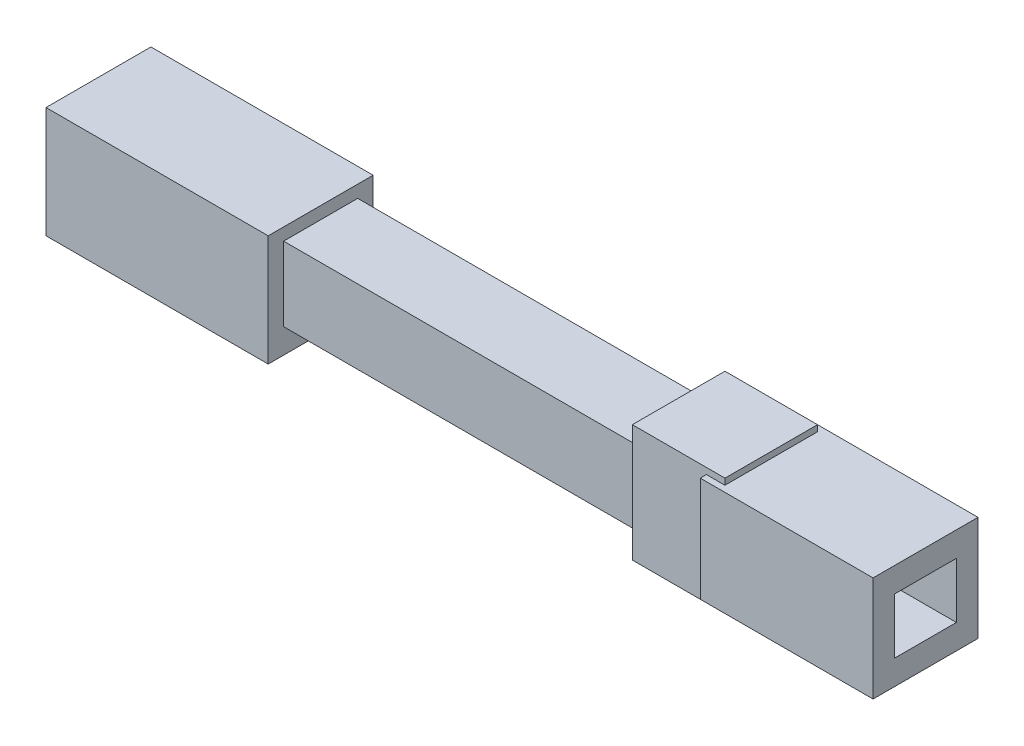
ISO-10303-21;
HEADER;
FILE_DESCRIPTION(('STEP AP214'),'2;1');
FILE_NAME('part.step','',(''),(''),'','','');
FILE_SCHEMA(('AUTOMOTIVE_DESIGN { 1 0 10303 214 1 1 1 1 }'));
ENDSEC;
DATA;
#1=APPLICATION_CONTEXT('core data for automotive mechanical design processes');
#2=APPLICATION_PROTOCOL_DEFINITION('international standard','automotive_design',2000,#1);
#3=PRODUCT_CONTEXT('',#1,'mechanical');
#4=PRODUCT('Part','Part','',(#3));
#5=PRODUCT_RELATED_PRODUCT_CATEGORY('part','',(#4));
#6=PRODUCT_DEFINITION_FORMATION('','',#4);
#7=PRODUCT_DEFINITION_CONTEXT('part definition',#1,'design');
#8=PRODUCT_DEFINITION('design','',#6,#7);
#9=PRODUCT_DEFINITION_SHAPE('','',#8);
#10=(LENGTH_UNIT() NAMED_UNIT(*) SI_UNIT(.MILLI.,.METRE.));
#11=(NAMED_UNIT(*) PLANE_ANGLE_UNIT() SI_UNIT($,.RADIAN.));
#12=(NAMED_UNIT(*) SI_UNIT($,.STERADIAN.) SOLID_ANGLE_UNIT());
#13=UNCERTAINTY_MEASURE_WITH_UNIT(LENGTH_MEASURE(1.E-05),#10,'distance_accuracy_value','');
#14=(GEOMETRIC_REPRESENTATION_CONTEXT(3) GLOBAL_UNCERTAINTY_ASSIGNED_CONTEXT((#13)) GLOBAL_UNIT_ASSIGNED_CONTEXT((#10,
#11,#12)) REPRESENTATION_CONTEXT('',''));
#15=CARTESIAN_POINT('',(0.,0.,0.));
#16=DIRECTION('',(0.,0.,1.));
#17=DIRECTION('',(1.,0.,0.));
#18=AXIS2_PLACEMENT_3D('',#15,#16,#17);
#19=CARTESIAN_POINT('',(198.,184.,15.));
#20=DIRECTION('',(-1.,0.,0.));
#21=DIRECTION('',(0.,0.,1.));
#22=AXIS2_PLACEMENT_3D('',#19,#20,#21);
#23=PLANE('',#22);
#24=DIRECTION('',(0.,0.,-1.));
#25=VECTOR('',#24,1.);
#26=CARTESIAN_POINT('',(198.,186.,15.));
#27=LINE('',#26,#25);
#28=CARTESIAN_POINT('',(198.,186.,15.));
#29=VERTEX_POINT('',#28);
#30=CARTESIAN_POINT('',(198.,186.,-15.));
#31=VERTEX_POINT('',#30);
#32=EDGE_CURVE('E297',#29,#31,#27,.T.);
#33=ORIENTED_EDGE('',*,*,#32,.F.);
#34=DIRECTION('',(0.,1.,0.));
#35=VECTOR('',#34,1.);
#36=CARTESIAN_POINT('',(198.,184.,15.));
#37=LINE('',#36,#35);
#38=CARTESIAN_POINT('',(198.,184.,15.));
#39=VERTEX_POINT('',#38);
#40=EDGE_CURVE('E317',#39,#29,#37,.T.);
#41=ORIENTED_EDGE('',*,*,#40,.F.);
#42=DIRECTION('',(0.,0.,-1.));
#43=VECTOR('',#42,1.);
#44=CARTESIAN_POINT('',(198.,184.,15.));
#45=LINE('',#44,#43);
#46=CARTESIAN_POINT('',(198.,184.,-15.));
#47=VERTEX_POINT('',#46);
#48=EDGE_CURVE('E350',#39,#47,#45,.T.);
#49=ORIENTED_EDGE('',*,*,#48,.T.);
#50=DIRECTION('',(0.,1.,0.));
#51=VECTOR('',#50,1.);
#52=CARTESIAN_POINT('',(198.,184.,-15.));
#53=LINE('',#52,#51);
#54=EDGE_CURVE('E331',#47,#31,#53,.T.);
#55=ORIENTED_EDGE('',*,*,#54,.T.);
#56=EDGE_LOOP('',(#33,#41,#49,#55));
#57=FACE_BOUND('',#56,.T.);
#58=ADVANCED_FACE('F44',(#57),#23,.F.);
#59=DIRECTION('',(0.,0.,1.));
#60=VECTOR('',#59,1.);
#61=CARTESIAN_POINT('',(198.,220.,15.));
#62=LINE('',#61,#60);
#63=CARTESIAN_POINT('',(198.,220.,-15.));
#64=VERTEX_POINT('',#63);
#65=CARTESIAN_POINT('',(198.,220.,15.));
#66=VERTEX_POINT('',#65);
#67=EDGE_CURVE('E294',#64,#66,#62,.T.);
#68=ORIENTED_EDGE('',*,*,#67,.F.);
#69=CARTESIAN_POINT('',(198.,222.,-15.));
#70=VERTEX_POINT('',#69);
#71=EDGE_CURVE('E334',#64,#70,#53,.T.);
#72=ORIENTED_EDGE('',*,*,#71,.T.);
#73=DIRECTION('',(0.,0.,-1.));
#74=VECTOR('',#73,1.);
#75=CARTESIAN_POINT('',(198.,222.,15.));
#76=LINE('',#75,#74);
#77=CARTESIAN_POINT('',(198.,222.,15.));
#78=VERTEX_POINT('',#77);
#79=EDGE_CURVE('E342',#78,#70,#76,.T.);
#80=ORIENTED_EDGE('',*,*,#79,.F.);
#81=EDGE_CURVE('E318',#66,#78,#37,.T.);
#82=ORIENTED_EDGE('',*,*,#81,.F.);
#83=EDGE_LOOP('',(#68,#72,#80,#82));
#84=FACE_BOUND('',#83,.T.);
#85=ADVANCED_FACE('F478',(#84),#23,.F.);
#86=CARTESIAN_POINT('',(0.,0.,15.));
#87=DIRECTION('',(0.,0.,-1.));
#88=DIRECTION('',(-1.,0.,0.));
#89=AXIS2_PLACEMENT_3D('',#86,#87,#88);
#90=PLANE('',#89);
#91=DIRECTION('',(1.,0.,0.));
#92=VECTOR('',#91,1.);
#93=CARTESIAN_POINT('',(0.,186.,15.));
#94=LINE('',#93,#92);
#95=CARTESIAN_POINT('',(192.,186.,15.));
#96=VERTEX_POINT('',#95);
#97=EDGE_CURVE('E302',#96,#29,#94,.T.);
#98=ORIENTED_EDGE('',*,*,#97,.F.);
#99=DIRECTION('',(0.,-1.,0.));
#100=VECTOR('',#99,1.);
#101=CARTESIAN_POINT('',(192.,0.,15.));
#102=LINE('',#101,#100);
#103=CARTESIAN_POINT('',(192.,220.,15.));
#104=VERTEX_POINT('',#103);
#105=EDGE_CURVE('E308',#104,#96,#102,.T.);
#106=ORIENTED_EDGE('',*,*,#105,.F.);
#107=DIRECTION('',(-1.,0.,0.));
#108=VECTOR('',#107,1.);
#109=CARTESIAN_POINT('',(0.,220.,15.));
#110=LINE('',#109,#108);
#111=EDGE_CURVE('E296',#66,#104,#110,.T.);
#112=ORIENTED_EDGE('',*,*,#111,.F.);
#113=ORIENTED_EDGE('',*,*,#81,.T.);
#114=DIRECTION('',(-1.,0.,0.));
#115=VECTOR('',#114,1.);
#116=CARTESIAN_POINT('',(168.,222.,15.));
#117=LINE('',#116,#115);
#118=CARTESIAN_POINT('',(168.,222.,15.));
#119=VERTEX_POINT('',#118);
#120=EDGE_CURVE('E323',#78,#119,#117,.T.);
#121=ORIENTED_EDGE('',*,*,#120,.T.);
#122=DIRECTION('',(0.,-1.,0.));
#123=VECTOR('',#122,1.);
#124=CARTESIAN_POINT('',(168.,184.,15.));
#125=LINE('',#124,#123);
#126=CARTESIAN_POINT('',(168.,184.,15.));
#127=VERTEX_POINT('',#126);
#128=EDGE_CURVE('E309',#119,#127,#125,.T.);
#129=ORIENTED_EDGE('',*,*,#128,.T.);
#130=DIRECTION('',(1.,0.,0.));
#131=VECTOR('',#130,1.);
#132=CARTESIAN_POINT('',(168.,184.,15.));
#133=LINE('',#132,#131);
#134=EDGE_CURVE('E314',#127,#39,#133,.T.);
#135=ORIENTED_EDGE('',*,*,#134,.T.);
#136=ORIENTED_EDGE('',*,*,#40,.T.);
#137=EDGE_LOOP('',(#98,#106,#112,#113,#121,#129,#135,#136));
#138=FACE_BOUND('',#137,.T.);
#139=ADVANCED_FACE('F483',(#138),#90,.F.);
#140=CARTESIAN_POINT('',(0.,0.,-15.));
#141=DIRECTION('',(0.,0.,-1.));
#142=DIRECTION('',(-1.,0.,0.));
#143=AXIS2_PLACEMENT_3D('',#140,#141,#142);
#144=PLANE('',#143);
#145=DIRECTION('',(0.,-1.,0.));
#146=VECTOR('',#145,1.);
#147=CARTESIAN_POINT('',(192.,0.,-15.));
#148=LINE('',#147,#146);
#149=CARTESIAN_POINT('',(192.,220.,-15.));
#150=VERTEX_POINT('',#149);
#151=CARTESIAN_POINT('',(192.,186.,-15.));
#152=VERTEX_POINT('',#151);
#153=EDGE_CURVE('E444',#150,#152,#148,.T.);
#154=ORIENTED_EDGE('',*,*,#153,.T.);
#155=DIRECTION('',(1.,0.,0.));
#156=VECTOR('',#155,1.);
#157=CARTESIAN_POINT('',(0.,186.,-15.));
#158=LINE('',#157,#156);
#159=EDGE_CURVE('E446',#152,#31,#158,.T.);
#160=ORIENTED_EDGE('',*,*,#159,.T.);
#161=ORIENTED_EDGE('',*,*,#54,.F.);
#162=DIRECTION('',(1.,0.,0.));
#163=VECTOR('',#162,1.);
#164=CARTESIAN_POINT('',(168.,184.,-15.));
#165=LINE('',#164,#163);
#166=CARTESIAN_POINT('',(168.,184.,-15.));
#167=VERTEX_POINT('',#166);
#168=EDGE_CURVE('E329',#167,#47,#165,.T.);
#169=ORIENTED_EDGE('',*,*,#168,.F.);
#170=DIRECTION('',(0.,-1.,0.));
#171=VECTOR('',#170,1.);
#172=CARTESIAN_POINT('',(168.,184.,-15.));
#173=LINE('',#172,#171);
#174=CARTESIAN_POINT('',(168.,222.,-15.));
#175=VERTEX_POINT('',#174);
#176=EDGE_CURVE('E310',#175,#167,#173,.T.);
#177=ORIENTED_EDGE('',*,*,#176,.F.);
#178=DIRECTION('',(-1.,0.,0.));
#179=VECTOR('',#178,1.);
#180=CARTESIAN_POINT('',(168.,222.,-15.));
#181=LINE('',#180,#179);
#182=EDGE_CURVE('E312',#70,#175,#181,.T.);
#183=ORIENTED_EDGE('',*,*,#182,.F.);
#184=ORIENTED_EDGE('',*,*,#71,.F.);
#185=DIRECTION('',(-1.,0.,0.));
#186=VECTOR('',#185,1.);
#187=CARTESIAN_POINT('',(0.,220.,-15.));
#188=LINE('',#187,#186);
#189=EDGE_CURVE('E438',#64,#150,#188,.T.);
#190=ORIENTED_EDGE('',*,*,#189,.T.);
#191=EDGE_LOOP('',(#154,#160,#161,#169,#177,#183,#184,#190));
#192=FACE_BOUND('',#191,.T.);
#193=ADVANCED_FACE('F513',(#192),#144,.T.);
#194=CARTESIAN_POINT('',(48.,190.,12.));
#195=DIRECTION('',(0.,1.,0.));
#196=DIRECTION('',(0.,0.,1.));
#197=AXIS2_PLACEMENT_3D('',#194,#195,#196);
#198=PLANE('',#197);
#199=DIRECTION('',(0.,0.,-1.));
#200=VECTOR('',#199,1.);
#201=CARTESIAN_POINT('',(168.,190.,12.));
#202=LINE('',#201,#200);
#203=CARTESIAN_POINT('',(168.,190.,12.));
#204=VERTEX_POINT('',#203);
#205=CARTESIAN_POINT('',(168.,190.,-12.));
#206=VERTEX_POINT('',#205);
#207=EDGE_CURVE('E357',#204,#206,#202,.T.);
#208=ORIENTED_EDGE('',*,*,#207,.F.);
#209=DIRECTION('',(1.,0.,0.));
#210=VECTOR('',#209,1.);
#211=CARTESIAN_POINT('',(48.,190.,12.));
#212=LINE('',#211,#210);
#213=CARTESIAN_POINT('',(52.,190.,12.));
#214=VERTEX_POINT('',#213);
#215=EDGE_CURVE('E364',#214,#204,#212,.T.);
#216=ORIENTED_EDGE('',*,*,#215,.F.);
#217=DIRECTION('',(0.,0.,-1.));
#218=VECTOR('',#217,1.);
#219=CARTESIAN_POINT('',(52.,190.,17.));
#220=LINE('',#219,#218);
#221=CARTESIAN_POINT('',(52.,190.,-12.));
#222=VERTEX_POINT('',#221);
#223=EDGE_CURVE('E428',#214,#222,#220,.T.);
#224=ORIENTED_EDGE('',*,*,#223,.T.);
#225=DIRECTION('',(1.,0.,0.));
#226=VECTOR('',#225,1.);
#227=CARTESIAN_POINT('',(48.,190.,-12.));
#228=LINE('',#227,#226);
#229=EDGE_CURVE('E365',#222,#206,#228,.T.);
#230=ORIENTED_EDGE('',*,*,#229,.T.);
#231=EDGE_LOOP('',(#208,#216,#224,#230));
#232=FACE_BOUND('',#231,.T.);
#233=ADVANCED_FACE('F512',(#232),#198,.F.);
#234=CARTESIAN_POINT('',(48.,214.,12.));
#235=DIRECTION('',(0.,-1.,0.));
#236=DIRECTION('',(0.,0.,-1.));
#237=AXIS2_PLACEMENT_3D('',#234,#235,#236);
#238=PLANE('',#237);
#239=DIRECTION('',(0.,0.,1.));
#240=VECTOR('',#239,1.);
#241=CARTESIAN_POINT('',(168.,214.,12.));
#242=LINE('',#241,#240);
#243=CARTESIAN_POINT('',(168.,214.,-12.));
#244=VERTEX_POINT('',#243);
#245=CARTESIAN_POINT('',(168.,214.,12.));
#246=VERTEX_POINT('',#245);
#247=EDGE_CURVE('E352',#244,#246,#242,.T.);
#248=ORIENTED_EDGE('',*,*,#247,.F.);
#249=DIRECTION('',(-1.,0.,0.));
#250=VECTOR('',#249,1.);
#251=CARTESIAN_POINT('',(48.,214.,-12.));
#252=LINE('',#251,#250);
#253=CARTESIAN_POINT('',(52.,214.,-12.));
#254=VERTEX_POINT('',#253);
#255=EDGE_CURVE('E367',#244,#254,#252,.T.);
#256=ORIENTED_EDGE('',*,*,#255,.T.);
#257=DIRECTION('',(0.,0.,1.));
#258=VECTOR('',#257,1.);
#259=CARTESIAN_POINT('',(52.,214.,17.));
#260=LINE('',#259,#258);
#261=CARTESIAN_POINT('',(52.,214.,12.));
#262=VERTEX_POINT('',#261);
#263=EDGE_CURVE('E424',#254,#262,#260,.T.);
#264=ORIENTED_EDGE('',*,*,#263,.T.);
#265=DIRECTION('',(-1.,0.,0.));
#266=VECTOR('',#265,1.);
#267=CARTESIAN_POINT('',(48.,214.,12.));
#268=LINE('',#267,#266);
#269=EDGE_CURVE('E369',#246,#262,#268,.T.);
#270=ORIENTED_EDGE('',*,*,#269,.F.);
#271=EDGE_LOOP('',(#248,#256,#264,#270));
#272=FACE_BOUND('',#271,.T.);
#273=ADVANCED_FACE('F505',(#272),#238,.F.);
#274=CARTESIAN_POINT('',(0.,0.,12.));
#275=DIRECTION('',(0.,0.,-1.));
#276=DIRECTION('',(-1.,0.,0.));
#277=AXIS2_PLACEMENT_3D('',#274,#275,#276);
#278=PLANE('',#277);
#279=DIRECTION('',(0.,-1.,0.));
#280=VECTOR('',#279,1.);
#281=CARTESIAN_POINT('',(168.,0.,12.));
#282=LINE('',#281,#280);
#283=EDGE_CURVE('E363',#246,#204,#282,.T.);
#284=ORIENTED_EDGE('',*,*,#283,.F.);
#285=ORIENTED_EDGE('',*,*,#269,.T.);
#286=DIRECTION('',(0.,-1.,0.));
#287=VECTOR('',#286,1.);
#288=CARTESIAN_POINT('',(52.,182.,12.));
#289=LINE('',#288,#287);
#290=EDGE_CURVE('E435',#262,#214,#289,.T.);
#291=ORIENTED_EDGE('',*,*,#290,.T.);
#292=ORIENTED_EDGE('',*,*,#215,.T.);
#293=EDGE_LOOP('',(#284,#285,#291,#292));
#294=FACE_BOUND('',#293,.T.);
#295=ADVANCED_FACE('F496',(#294),#278,.F.);
#296=CARTESIAN_POINT('',(0.,0.,-12.));
#297=DIRECTION('',(0.,0.,-1.));
#298=DIRECTION('',(-1.,0.,0.));
#299=AXIS2_PLACEMENT_3D('',#296,#297,#298);
#300=PLANE('',#299);
#301=CARTESIAN_POINT('',(110.,202.,-12.));
#302=DIRECTION('',(0.,0.,-1.));
#303=DIRECTION('',(-1.,0.,0.));
#304=AXIS2_PLACEMENT_3D('',#301,#302,#303);
#305=CIRCLE('',#304,7.49999999999999);
#306=CARTESIAN_POINT('',(102.5,202.,-12.));
#307=VERTEX_POINT('',#306);
#308=EDGE_CURVE('E47',#307,#307,#305,.T.);
#309=ORIENTED_EDGE('',*,*,#308,.F.);
#310=EDGE_LOOP('',(#309));
#311=FACE_BOUND('',#310,.T.);
#312=ORIENTED_EDGE('',*,*,#255,.F.);
#313=DIRECTION('',(0.,-1.,0.));
#314=VECTOR('',#313,1.);
#315=CARTESIAN_POINT('',(168.,0.,-12.));
#316=LINE('',#315,#314);
#317=EDGE_CURVE('E434',#244,#206,#316,.T.);
#318=ORIENTED_EDGE('',*,*,#317,.T.);
#319=ORIENTED_EDGE('',*,*,#229,.F.);
#320=DIRECTION('',(0.,-1.,0.));
#321=VECTOR('',#320,1.);
#322=CARTESIAN_POINT('',(52.,182.,-12.));
#323=LINE('',#322,#321);
#324=EDGE_CURVE('E419',#254,#222,#323,.T.);
#325=ORIENTED_EDGE('',*,*,#324,.F.);
#326=EDGE_LOOP('',(#312,#318,#319,#325));
#327=FACE_BOUND('',#326,.T.);
#328=ADVANCED_FACE('F501',(#311,#327),#300,.T.);
#329=CARTESIAN_POINT('',(52.,182.,17.));
#330=DIRECTION('',(-1.,0.,0.));
#331=DIRECTION('',(0.,0.,1.));
#332=AXIS2_PLACEMENT_3D('',#329,#330,#331);
#333=PLANE('',#332);
#334=DIRECTION('',(0.,1.,0.));
#335=VECTOR('',#334,1.);
#336=CARTESIAN_POINT('',(52.,182.,-17.));
#337=LINE('',#336,#335);
#338=CARTESIAN_POINT('',(52.,182.,-17.));
#339=VERTEX_POINT('',#338);
#340=CARTESIAN_POINT('',(52.,218.,-17.));
#341=VERTEX_POINT('',#340);
#342=EDGE_CURVE('E399',#339,#341,#337,.T.);
#343=ORIENTED_EDGE('',*,*,#342,.T.);
#344=DIRECTION('',(0.,0.,-1.));
#345=VECTOR('',#344,1.);
#346=CARTESIAN_POINT('',(52.,218.,17.));
#347=LINE('',#346,#345);
#348=CARTESIAN_POINT('',(52.,218.,17.));
#349=VERTEX_POINT('',#348);
#350=EDGE_CURVE('E410',#349,#341,#347,.T.);
#351=ORIENTED_EDGE('',*,*,#350,.F.);
#352=DIRECTION('',(0.,1.,0.));
#353=VECTOR('',#352,1.);
#354=CARTESIAN_POINT('',(52.,182.,17.));
#355=LINE('',#354,#353);
#356=CARTESIAN_POINT('',(52.,182.,17.));
#357=VERTEX_POINT('',#356);
#358=EDGE_CURVE('E390',#357,#349,#355,.T.);
#359=ORIENTED_EDGE('',*,*,#358,.F.);
#360=DIRECTION('',(0.,0.,-1.));
#361=VECTOR('',#360,1.);
#362=CARTESIAN_POINT('',(52.,182.,17.));
#363=LINE('',#362,#361);
#364=EDGE_CURVE('E415',#357,#339,#363,.T.);
#365=ORIENTED_EDGE('',*,*,#364,.T.);
#366=EDGE_LOOP('',(#343,#351,#359,#365));
#367=FACE_BOUND('',#366,.T.);
#368=ORIENTED_EDGE('',*,*,#290,.F.);
#369=ORIENTED_EDGE('',*,*,#263,.F.);
#370=ORIENTED_EDGE('',*,*,#324,.T.);
#371=ORIENTED_EDGE('',*,*,#223,.F.);
#372=EDGE_LOOP('',(#368,#369,#370,#371));
#373=FACE_BOUND('',#372,.T.);
#374=ADVANCED_FACE('F510',(#367,#373),#333,.F.);
#375=CARTESIAN_POINT('',(-20.,182.,17.));
#376=DIRECTION('',(1.,0.,0.));
#377=DIRECTION('',(0.,0.,-1.));
#378=AXIS2_PLACEMENT_3D('',#375,#376,#377);
#379=PLANE('',#378);
#380=DIRECTION('',(0.,-1.,0.));
#381=VECTOR('',#380,1.);
#382=CARTESIAN_POINT('',(-20.,182.,-17.));
#383=LINE('',#382,#381);
#384=CARTESIAN_POINT('',(-20.,218.,-17.));
#385=VERTEX_POINT('',#384);
#386=CARTESIAN_POINT('',(-20.,182.,-17.));
#387=VERTEX_POINT('',#386);
#388=EDGE_CURVE('E373',#385,#387,#383,.T.);
#389=ORIENTED_EDGE('',*,*,#388,.T.);
#390=DIRECTION('',(0.,0.,-1.));
#391=VECTOR('',#390,1.);
#392=CARTESIAN_POINT('',(-20.,182.,17.));
#393=LINE('',#392,#391);
#394=CARTESIAN_POINT('',(-20.,182.,17.));
#395=VERTEX_POINT('',#394);
#396=EDGE_CURVE('E418',#395,#387,#393,.T.);
#397=ORIENTED_EDGE('',*,*,#396,.F.);
#398=DIRECTION('',(0.,-1.,0.));
#399=VECTOR('',#398,1.);
#400=CARTESIAN_POINT('',(-20.,182.,17.));
#401=LINE('',#400,#399);
#402=CARTESIAN_POINT('',(-20.,218.,17.));
#403=VERTEX_POINT('',#402);
#404=EDGE_CURVE('E377',#403,#395,#401,.T.);
#405=ORIENTED_EDGE('',*,*,#404,.F.);
#406=DIRECTION('',(0.,0.,-1.));
#407=VECTOR('',#406,1.);
#408=CARTESIAN_POINT('',(-20.,218.,17.));
#409=LINE('',#408,#407);
#410=EDGE_CURVE('E395',#403,#385,#409,.T.);
#411=ORIENTED_EDGE('',*,*,#410,.T.);
#412=EDGE_LOOP('',(#389,#397,#405,#411));
#413=FACE_BOUND('',#412,.T.);
#414=ADVANCED_FACE('F50',(#413),#379,.F.);
#415=CARTESIAN_POINT('',(-20.,182.,17.));
#416=DIRECTION('',(0.,1.,0.));
#417=DIRECTION('',(0.,0.,1.));
#418=AXIS2_PLACEMENT_3D('',#415,#416,#417);
#419=PLANE('',#418);
#420=DIRECTION('',(1.,0.,0.));
#421=VECTOR('',#420,1.);
#422=CARTESIAN_POINT('',(-20.,182.,-17.));
#423=LINE('',#422,#421);
#424=EDGE_CURVE('E400',#387,#339,#423,.T.);
#425=ORIENTED_EDGE('',*,*,#424,.T.);
#426=ORIENTED_EDGE('',*,*,#364,.F.);
#427=DIRECTION('',(1.,0.,0.));
#428=VECTOR('',#427,1.);
#429=CARTESIAN_POINT('',(-20.,182.,17.));
#430=LINE('',#429,#428);
#431=EDGE_CURVE('E382',#395,#357,#430,.T.);
#432=ORIENTED_EDGE('',*,*,#431,.F.);
#433=ORIENTED_EDGE('',*,*,#396,.T.);
#434=EDGE_LOOP('',(#425,#426,#432,#433));
#435=FACE_BOUND('',#434,.T.);
#436=ADVANCED_FACE('F527',(#435),#419,.F.);
#437=CARTESIAN_POINT('',(-20.,218.,17.));
#438=DIRECTION('',(0.,-1.,0.));
#439=DIRECTION('',(0.,0.,-1.));
#440=AXIS2_PLACEMENT_3D('',#437,#438,#439);
#441=PLANE('',#440);
#442=DIRECTION('',(-1.,0.,0.));
#443=VECTOR('',#442,1.);
#444=CARTESIAN_POINT('',(-20.,218.,-17.));
#445=LINE('',#444,#443);
#446=EDGE_CURVE('E383',#341,#385,#445,.T.);
#447=ORIENTED_EDGE('',*,*,#446,.T.);
#448=ORIENTED_EDGE('',*,*,#410,.F.);
#449=DIRECTION('',(-1.,0.,0.));
#450=VECTOR('',#449,1.);
#451=CARTESIAN_POINT('',(-20.,218.,17.));
#452=LINE('',#451,#450);
#453=EDGE_CURVE('E388',#349,#403,#452,.T.);
#454=ORIENTED_EDGE('',*,*,#453,.F.);
#455=ORIENTED_EDGE('',*,*,#350,.T.);
#456=EDGE_LOOP('',(#447,#448,#454,#455));
#457=FACE_BOUND('',#456,.T.);
#458=ADVANCED_FACE('F517',(#457),#441,.F.);
#459=CARTESIAN_POINT('',(0.,0.,17.));
#460=DIRECTION('',(0.,0.,-1.));
#461=DIRECTION('',(-1.,0.,0.));
#462=AXIS2_PLACEMENT_3D('',#459,#460,#461);
#463=PLANE('',#462);
#464=ORIENTED_EDGE('',*,*,#404,.T.);
#465=ORIENTED_EDGE('',*,*,#431,.T.);
#466=ORIENTED_EDGE('',*,*,#358,.T.);
#467=ORIENTED_EDGE('',*,*,#453,.T.);
#468=EDGE_LOOP('',(#464,#465,#466,#467));
#469=FACE_BOUND('',#468,.T.);
#470=ADVANCED_FACE('F516',(#469),#463,.F.);
#471=CARTESIAN_POINT('',(0.,0.,-17.));
#472=DIRECTION('',(0.,0.,-1.));
#473=DIRECTION('',(-1.,0.,0.));
#474=AXIS2_PLACEMENT_3D('',#471,#472,#473);
#475=PLANE('',#474);
#476=CARTESIAN_POINT('',(0.,198.,-17.));
#477=DIRECTION('',(0.,0.,1.));
#478=DIRECTION('',(1.,0.,0.));
#479=AXIS2_PLACEMENT_3D('',#476,#477,#478);
#480=CIRCLE('',#479,7.25);
#481=CARTESIAN_POINT('',(7.25,198.,-17.));
#482=VERTEX_POINT('',#481);
#483=EDGE_CURVE('E246',#482,#482,#480,.T.);
#484=ORIENTED_EDGE('',*,*,#483,.T.);
#485=EDGE_LOOP('',(#484));
#486=FACE_BOUND('',#485,.T.);
#487=ORIENTED_EDGE('',*,*,#388,.F.);
#488=ORIENTED_EDGE('',*,*,#446,.F.);
#489=ORIENTED_EDGE('',*,*,#342,.F.);
#490=ORIENTED_EDGE('',*,*,#424,.F.);
#491=EDGE_LOOP('',(#487,#488,#489,#490));
#492=FACE_BOUND('',#491,.T.);
#493=ADVANCED_FACE('F500',(#486,#492),#475,.T.);
#494=CARTESIAN_POINT('',(168.,184.,15.));
#495=DIRECTION('',(1.,0.,0.));
#496=DIRECTION('',(0.,0.,-1.));
#497=AXIS2_PLACEMENT_3D('',#494,#495,#496);
#498=PLANE('',#497);
#499=ORIENTED_EDGE('',*,*,#176,.T.);
#500=DIRECTION('',(0.,0.,-1.));
#501=VECTOR('',#500,1.);
#502=CARTESIAN_POINT('',(168.,184.,15.));
#503=LINE('',#502,#501);
#504=EDGE_CURVE('E354',#127,#167,#503,.T.);
#505=ORIENTED_EDGE('',*,*,#504,.F.);
#506=ORIENTED_EDGE('',*,*,#128,.F.);
#507=DIRECTION('',(0.,0.,-1.));
#508=VECTOR('',#507,1.);
#509=CARTESIAN_POINT('',(168.,222.,15.));
#510=LINE('',#509,#508);
#511=EDGE_CURVE('E326',#119,#175,#510,.T.);
#512=ORIENTED_EDGE('',*,*,#511,.T.);
#513=EDGE_LOOP('',(#499,#505,#506,#512));
#514=FACE_BOUND('',#513,.T.);
#515=ORIENTED_EDGE('',*,*,#247,.T.);
#516=ORIENTED_EDGE('',*,*,#283,.T.);
#517=ORIENTED_EDGE('',*,*,#207,.T.);
#518=ORIENTED_EDGE('',*,*,#317,.F.);
#519=EDGE_LOOP('',(#515,#516,#517,#518));
#520=FACE_BOUND('',#519,.T.);
#521=ADVANCED_FACE('F492',(#514,#520),#498,.F.);
#522=CARTESIAN_POINT('',(168.,184.,15.));
#523=DIRECTION('',(0.,1.,0.));
#524=DIRECTION('',(0.,0.,1.));
#525=AXIS2_PLACEMENT_3D('',#522,#523,#524);
#526=PLANE('',#525);
#527=ORIENTED_EDGE('',*,*,#168,.T.);
#528=ORIENTED_EDGE('',*,*,#48,.F.);
#529=ORIENTED_EDGE('',*,*,#134,.F.);
#530=ORIENTED_EDGE('',*,*,#504,.T.);
#531=EDGE_LOOP('',(#527,#528,#529,#530));
#532=FACE_BOUND('',#531,.T.);
#533=ADVANCED_FACE('F489',(#532),#526,.F.);
#534=CARTESIAN_POINT('',(168.,222.,15.));
#535=DIRECTION('',(0.,-1.,0.));
#536=DIRECTION('',(0.,0.,-1.));
#537=AXIS2_PLACEMENT_3D('',#534,#535,#536);
#538=PLANE('',#537);
#539=ORIENTED_EDGE('',*,*,#182,.T.);
#540=ORIENTED_EDGE('',*,*,#511,.F.);
#541=ORIENTED_EDGE('',*,*,#120,.F.);
#542=ORIENTED_EDGE('',*,*,#79,.T.);
#543=EDGE_LOOP('',(#539,#540,#541,#542));
#544=FACE_BOUND('',#543,.T.);
#545=ADVANCED_FACE('F488',(#544),#538,.F.);
#546=CARTESIAN_POINT('',(192.,186.,17.));
#547=DIRECTION('',(1.,0.,0.));
#548=DIRECTION('',(0.,0.,-1.));
#549=AXIS2_PLACEMENT_3D('',#546,#547,#548);
#550=PLANE('',#549);
#551=DIRECTION('',(0.,0.,-1.));
#552=VECTOR('',#551,1.);
#553=CARTESIAN_POINT('',(192.,220.,17.));
#554=LINE('',#553,#552);
#555=CARTESIAN_POINT('',(192.,220.,17.));
#556=VERTEX_POINT('',#555);
#557=EDGE_CURVE('E280',#556,#104,#554,.T.);
#558=ORIENTED_EDGE('',*,*,#557,.T.);
#559=ORIENTED_EDGE('',*,*,#105,.T.);
#560=DIRECTION('',(0.,0.,-1.));
#561=VECTOR('',#560,1.);
#562=CARTESIAN_POINT('',(192.,186.,17.));
#563=LINE('',#562,#561);
#564=CARTESIAN_POINT('',(192.,186.,17.));
#565=VERTEX_POINT('',#564);
#566=EDGE_CURVE('E289',#565,#96,#563,.T.);
#567=ORIENTED_EDGE('',*,*,#566,.F.);
#568=DIRECTION('',(0.,-1.,0.));
#569=VECTOR('',#568,1.);
#570=CARTESIAN_POINT('',(192.,186.,17.));
#571=LINE('',#570,#569);
#572=EDGE_CURVE('E252',#556,#565,#571,.T.);
#573=ORIENTED_EDGE('',*,*,#572,.F.);
#574=EDGE_LOOP('',(#558,#559,#567,#573));
#575=FACE_BOUND('',#574,.T.);
#576=ADVANCED_FACE('F635',(#575),#550,.F.);
#577=CARTESIAN_POINT('',(192.,186.,17.));
#578=DIRECTION('',(0.,1.,0.));
#579=DIRECTION('',(0.,0.,1.));
#580=AXIS2_PLACEMENT_3D('',#577,#578,#579);
#581=PLANE('',#580);
#582=ORIENTED_EDGE('',*,*,#566,.T.);
#583=ORIENTED_EDGE('',*,*,#97,.T.);
#584=ORIENTED_EDGE('',*,*,#32,.T.);
#585=ORIENTED_EDGE('',*,*,#159,.F.);
#586=CARTESIAN_POINT('',(192.,186.,-17.));
#587=VERTEX_POINT('',#586);
#588=EDGE_CURVE('E288',#152,#587,#563,.T.);
#589=ORIENTED_EDGE('',*,*,#588,.T.);
#590=DIRECTION('',(1.,0.,0.));
#591=VECTOR('',#590,1.);
#592=CARTESIAN_POINT('',(192.,186.,-17.));
#593=LINE('',#592,#591);
#594=CARTESIAN_POINT('',(248.,186.,-17.));
#595=VERTEX_POINT('',#594);
#596=EDGE_CURVE('E267',#587,#595,#593,.T.);
#597=ORIENTED_EDGE('',*,*,#596,.T.);
#598=DIRECTION('',(0.,0.,-1.));
#599=VECTOR('',#598,1.);
#600=CARTESIAN_POINT('',(248.,186.,17.));
#601=LINE('',#600,#599);
#602=CARTESIAN_POINT('',(248.,186.,17.));
#603=VERTEX_POINT('',#602);
#604=EDGE_CURVE('E282',#603,#595,#601,.T.);
#605=ORIENTED_EDGE('',*,*,#604,.F.);
#606=DIRECTION('',(1.,0.,0.));
#607=VECTOR('',#606,1.);
#608=CARTESIAN_POINT('',(192.,186.,17.));
#609=LINE('',#608,#607);
#610=EDGE_CURVE('E258',#565,#603,#609,.T.);
#611=ORIENTED_EDGE('',*,*,#610,.F.);
#612=EDGE_LOOP('',(#582,#583,#584,#585,#589,#597,#605,#611));
#613=FACE_BOUND('',#612,.T.);
#614=ADVANCED_FACE('F663',(#613),#581,.F.);
#615=CARTESIAN_POINT('',(192.,220.,17.));
#616=DIRECTION('',(0.,-1.,0.));
#617=DIRECTION('',(0.,0.,-1.));
#618=AXIS2_PLACEMENT_3D('',#615,#616,#617);
#619=PLANE('',#618);
#620=ORIENTED_EDGE('',*,*,#67,.T.);
#621=ORIENTED_EDGE('',*,*,#111,.T.);
#622=ORIENTED_EDGE('',*,*,#557,.F.);
#623=DIRECTION('',(-1.,0.,0.));
#624=VECTOR('',#623,1.);
#625=CARTESIAN_POINT('',(192.,220.,17.));
#626=LINE('',#625,#624);
#627=CARTESIAN_POINT('',(248.,220.,17.));
#628=VERTEX_POINT('',#627);
#629=EDGE_CURVE('E263',#628,#556,#626,.T.);
#630=ORIENTED_EDGE('',*,*,#629,.F.);
#631=DIRECTION('',(0.,0.,-1.));
#632=VECTOR('',#631,1.);
#633=CARTESIAN_POINT('',(248.,220.,17.));
#634=LINE('',#633,#632);
#635=CARTESIAN_POINT('',(248.,220.,-17.));
#636=VERTEX_POINT('',#635);
#637=EDGE_CURVE('E284',#628,#636,#634,.T.);
#638=ORIENTED_EDGE('',*,*,#637,.T.);
#639=DIRECTION('',(-1.,0.,0.));
#640=VECTOR('',#639,1.);
#641=CARTESIAN_POINT('',(192.,220.,-17.));
#642=LINE('',#641,#640);
#643=CARTESIAN_POINT('',(192.,220.,-17.));
#644=VERTEX_POINT('',#643);
#645=EDGE_CURVE('E260',#636,#644,#642,.T.);
#646=ORIENTED_EDGE('',*,*,#645,.T.);
#647=EDGE_CURVE('E69',#150,#644,#554,.T.);
#648=ORIENTED_EDGE('',*,*,#647,.F.);
#649=ORIENTED_EDGE('',*,*,#189,.F.);
#650=EDGE_LOOP('',(#620,#621,#622,#630,#638,#646,#648,#649));
#651=FACE_BOUND('',#650,.T.);
#652=ADVANCED_FACE('F677',(#651),#619,.F.);
#653=ORIENTED_EDGE('',*,*,#153,.F.);
#654=ORIENTED_EDGE('',*,*,#647,.T.);
#655=DIRECTION('',(0.,-1.,0.));
#656=VECTOR('',#655,1.);
#657=CARTESIAN_POINT('',(192.,186.,-17.));
#658=LINE('',#657,#656);
#659=EDGE_CURVE('E249',#644,#587,#658,.T.);
#660=ORIENTED_EDGE('',*,*,#659,.T.);
#661=ORIENTED_EDGE('',*,*,#588,.F.);
#662=EDGE_LOOP('',(#653,#654,#660,#661));
#663=FACE_BOUND('',#662,.T.);
#664=ADVANCED_FACE('F670',(#663),#550,.F.);
#665=CARTESIAN_POINT('',(248.,186.,17.));
#666=DIRECTION('',(-1.,0.,0.));
#667=DIRECTION('',(0.,0.,1.));
#668=AXIS2_PLACEMENT_3D('',#665,#666,#667);
#669=PLANE('',#668);
#670=DIRECTION('',(0.,0.,-1.));
#671=VECTOR('',#670,1.);
#672=CARTESIAN_POINT('',(248.,212.,17.));
#673=LINE('',#672,#671);
#674=CARTESIAN_POINT('',(248.,212.,10.));
#675=VERTEX_POINT('',#674);
#676=CARTESIAN_POINT('',(248.,212.,-10.));
#677=VERTEX_POINT('',#676);
#678=EDGE_CURVE('E54',#675,#677,#673,.T.);
#679=ORIENTED_EDGE('',*,*,#678,.T.);
#680=DIRECTION('',(0.,-1.,0.));
#681=VECTOR('',#680,1.);
#682=CARTESIAN_POINT('',(248.,186.,-10.));
#683=LINE('',#682,#681);
#684=CARTESIAN_POINT('',(248.,194.,-10.));
#685=VERTEX_POINT('',#684);
#686=EDGE_CURVE('E11',#677,#685,#683,.T.);
#687=ORIENTED_EDGE('',*,*,#686,.T.);
#688=DIRECTION('',(0.,0.,1.));
#689=VECTOR('',#688,1.);
#690=CARTESIAN_POINT('',(248.,194.,17.));
#691=LINE('',#690,#689);
#692=CARTESIAN_POINT('',(248.,194.,10.));
#693=VERTEX_POINT('',#692);
#694=EDGE_CURVE('E229',#685,#693,#691,.T.);
#695=ORIENTED_EDGE('',*,*,#694,.T.);
#696=DIRECTION('',(0.,-1.,0.));
#697=VECTOR('',#696,1.);
#698=CARTESIAN_POINT('',(248.,186.,10.));
#699=LINE('',#698,#697);
#700=EDGE_CURVE('E451',#675,#693,#699,.T.);
#701=ORIENTED_EDGE('',*,*,#700,.F.);
#702=EDGE_LOOP('',(#679,#687,#695,#701));
#703=FACE_BOUND('',#702,.T.);
#704=DIRECTION('',(0.,1.,0.));
#705=VECTOR('',#704,1.);
#706=CARTESIAN_POINT('',(248.,186.,-17.));
#707=LINE('',#706,#705);
#708=EDGE_CURVE('E275',#595,#636,#707,.T.);
#709=ORIENTED_EDGE('',*,*,#708,.T.);
#710=ORIENTED_EDGE('',*,*,#637,.F.);
#711=DIRECTION('',(0.,1.,0.));
#712=VECTOR('',#711,1.);
#713=CARTESIAN_POINT('',(248.,186.,17.));
#714=LINE('',#713,#712);
#715=EDGE_CURVE('E257',#603,#628,#714,.T.);
#716=ORIENTED_EDGE('',*,*,#715,.F.);
#717=ORIENTED_EDGE('',*,*,#604,.T.);
#718=EDGE_LOOP('',(#709,#710,#716,#717));
#719=FACE_BOUND('',#718,.T.);
#720=ADVANCED_FACE('F458',(#703,#719),#669,.F.);
#721=CARTESIAN_POINT('',(0.,0.,17.));
#722=DIRECTION('',(0.,0.,-1.));
#723=DIRECTION('',(-1.,0.,0.));
#724=AXIS2_PLACEMENT_3D('',#721,#722,#723);
#725=PLANE('',#724);
#726=ORIENTED_EDGE('',*,*,#572,.T.);
#727=ORIENTED_EDGE('',*,*,#610,.T.);
#728=ORIENTED_EDGE('',*,*,#715,.T.);
#729=ORIENTED_EDGE('',*,*,#629,.T.);
#730=EDGE_LOOP('',(#726,#727,#728,#729));
#731=FACE_BOUND('',#730,.T.);
#732=ADVANCED_FACE('F703',(#731),#725,.F.);
#733=CARTESIAN_POINT('',(0.,0.,-17.));
#734=DIRECTION('',(0.,0.,-1.));
#735=DIRECTION('',(-1.,0.,0.));
#736=AXIS2_PLACEMENT_3D('',#733,#734,#735);
#737=PLANE('',#736);
#738=ORIENTED_EDGE('',*,*,#659,.F.);
#739=ORIENTED_EDGE('',*,*,#645,.F.);
#740=ORIENTED_EDGE('',*,*,#708,.F.);
#741=ORIENTED_EDGE('',*,*,#596,.F.);
#742=EDGE_LOOP('',(#738,#739,#740,#741));
#743=FACE_BOUND('',#742,.T.);
#744=ADVANCED_FACE('F712',(#743),#737,.T.);
#745=CARTESIAN_POINT('',(214.,212.,-10.));
#746=DIRECTION('',(0.,1.,0.));
#747=DIRECTION('',(0.,0.,1.));
#748=AXIS2_PLACEMENT_3D('',#745,#746,#747);
#749=PLANE('',#748);
#750=DIRECTION('',(-1.,0.,0.));
#751=VECTOR('',#750,1.);
#752=CARTESIAN_POINT('',(214.,212.,10.));
#753=LINE('',#752,#751);
#754=CARTESIAN_POINT('',(214.,212.,10.));
#755=VERTEX_POINT('',#754);
#756=EDGE_CURVE('E61',#675,#755,#753,.T.);
#757=ORIENTED_EDGE('',*,*,#756,.T.);
#758=DIRECTION('',(0.,0.,1.));
#759=VECTOR('',#758,1.);
#760=CARTESIAN_POINT('',(214.,212.,-10.));
#761=LINE('',#760,#759);
#762=CARTESIAN_POINT('',(214.,212.,-10.));
#763=VERTEX_POINT('',#762);
#764=EDGE_CURVE('E218',#763,#755,#761,.T.);
#765=ORIENTED_EDGE('',*,*,#764,.F.);
#766=DIRECTION('',(-1.,0.,0.));
#767=VECTOR('',#766,1.);
#768=CARTESIAN_POINT('',(214.,212.,-10.));
#769=LINE('',#768,#767);
#770=EDGE_CURVE('E219',#677,#763,#769,.T.);
#771=ORIENTED_EDGE('',*,*,#770,.F.);
#772=ORIENTED_EDGE('',*,*,#678,.F.);
#773=EDGE_LOOP('',(#757,#765,#771,#772));
#774=FACE_BOUND('',#773,.T.);
#775=ADVANCED_FACE('F465',(#774),#749,.F.);
#776=CARTESIAN_POINT('',(214.,194.,-10.));
#777=DIRECTION('',(0.,-1.,0.));
#778=DIRECTION('',(0.,0.,-1.));
#779=AXIS2_PLACEMENT_3D('',#776,#777,#778);
#780=PLANE('',#779);
#781=DIRECTION('',(1.,0.,0.));
#782=VECTOR('',#781,1.);
#783=CARTESIAN_POINT('',(214.,194.,-10.));
#784=LINE('',#783,#782);
#785=CARTESIAN_POINT('',(214.,194.,-10.));
#786=VERTEX_POINT('',#785);
#787=EDGE_CURVE('E224',#786,#685,#784,.T.);
#788=ORIENTED_EDGE('',*,*,#787,.F.);
#789=DIRECTION('',(0.,0.,1.));
#790=VECTOR('',#789,1.);
#791=CARTESIAN_POINT('',(214.,194.,-10.));
#792=LINE('',#791,#790);
#793=CARTESIAN_POINT('',(214.,194.,10.));
#794=VERTEX_POINT('',#793);
#795=EDGE_CURVE('E208',#786,#794,#792,.T.);
#796=ORIENTED_EDGE('',*,*,#795,.T.);
#797=DIRECTION('',(1.,0.,0.));
#798=VECTOR('',#797,1.);
#799=CARTESIAN_POINT('',(214.,194.,10.));
#800=LINE('',#799,#798);
#801=EDGE_CURVE('E237',#794,#693,#800,.T.);
#802=ORIENTED_EDGE('',*,*,#801,.T.);
#803=ORIENTED_EDGE('',*,*,#694,.F.);
#804=EDGE_LOOP('',(#788,#796,#802,#803));
#805=FACE_BOUND('',#804,.T.);
#806=ADVANCED_FACE('F221',(#805),#780,.F.);
#807=CARTESIAN_POINT('',(0.,0.,-10.));
#808=DIRECTION('',(0.,0.,-1.));
#809=DIRECTION('',(-1.,0.,0.));
#810=AXIS2_PLACEMENT_3D('',#807,#808,#809);
#811=PLANE('',#810);
#812=ORIENTED_EDGE('',*,*,#770,.T.);
#813=DIRECTION('',(0.,-1.,0.));
#814=VECTOR('',#813,1.);
#815=CARTESIAN_POINT('',(214.,194.,-10.));
#816=LINE('',#815,#814);
#817=EDGE_CURVE('E213',#763,#786,#816,.T.);
#818=ORIENTED_EDGE('',*,*,#817,.T.);
#819=ORIENTED_EDGE('',*,*,#787,.T.);
#820=ORIENTED_EDGE('',*,*,#686,.F.);
#821=EDGE_LOOP('',(#812,#818,#819,#820));
#822=FACE_BOUND('',#821,.T.);
#823=ADVANCED_FACE('F227',(#822),#811,.F.);
#824=CARTESIAN_POINT('',(0.,0.,10.));
#825=DIRECTION('',(0.,0.,-1.));
#826=DIRECTION('',(-1.,0.,0.));
#827=AXIS2_PLACEMENT_3D('',#824,#825,#826);
#828=PLANE('',#827);
#829=ORIENTED_EDGE('',*,*,#700,.T.);
#830=ORIENTED_EDGE('',*,*,#801,.F.);
#831=DIRECTION('',(0.,-1.,0.));
#832=VECTOR('',#831,1.);
#833=CARTESIAN_POINT('',(214.,194.,10.));
#834=LINE('',#833,#832);
#835=EDGE_CURVE('E212',#755,#794,#834,.T.);
#836=ORIENTED_EDGE('',*,*,#835,.F.);
#837=ORIENTED_EDGE('',*,*,#756,.F.);
#838=EDGE_LOOP('',(#829,#830,#836,#837));
#839=FACE_BOUND('',#838,.T.);
#840=ADVANCED_FACE('F463',(#839),#828,.T.);
#841=CARTESIAN_POINT('',(214.,194.,-10.));
#842=DIRECTION('',(-1.,0.,0.));
#843=DIRECTION('',(0.,0.,1.));
#844=AXIS2_PLACEMENT_3D('',#841,#842,#843);
#845=PLANE('',#844);
#846=ORIENTED_EDGE('',*,*,#835,.T.);
#847=ORIENTED_EDGE('',*,*,#795,.F.);
#848=ORIENTED_EDGE('',*,*,#817,.F.);
#849=ORIENTED_EDGE('',*,*,#764,.T.);
#850=EDGE_LOOP('',(#846,#847,#848,#849));
#851=FACE_BOUND('',#850,.T.);
#852=ADVANCED_FACE('F209',(#851),#845,.F.);
#853=CARTESIAN_POINT('',(0.,198.,-17.));
#854=DIRECTION('',(0.,0.,1.));
#855=DIRECTION('',(1.,0.,0.));
#856=AXIS2_PLACEMENT_3D('',#853,#854,#855);
#857=CYLINDRICAL_SURFACE('',#856,7.25);
#858=ORIENTED_EDGE('',*,*,#483,.F.);
#859=EDGE_LOOP('',(#858));
#860=FACE_BOUND('',#859,.T.);
#861=CARTESIAN_POINT('',(0.,198.,0.));
#862=DIRECTION('',(0.,0.,1.));
#863=DIRECTION('',(1.,0.,0.));
#864=AXIS2_PLACEMENT_3D('',#861,#862,#863);
#865=CIRCLE('',#864,7.25);
#866=CARTESIAN_POINT('',(7.25,198.,0.));
#867=VERTEX_POINT('',#866);
#868=EDGE_CURVE('E239',#867,#867,#865,.T.);
#869=ORIENTED_EDGE('',*,*,#868,.T.);
#870=EDGE_LOOP('',(#869));
#871=FACE_BOUND('',#870,.T.);
#872=ADVANCED_FACE('F473',(#860,#871),#857,.F.);
#873=CARTESIAN_POINT('',(0.,198.,0.));
#874=DIRECTION('',(0.,0.,1.));
#875=DIRECTION('',(1.,0.,0.));
#876=AXIS2_PLACEMENT_3D('',#873,#874,#875);
#877=PLANE('',#876);
#878=ORIENTED_EDGE('',*,*,#868,.F.);
#879=EDGE_LOOP('',(#878));
#880=FACE_BOUND('',#879,.T.);
#881=ADVANCED_FACE('F759',(#880),#877,.F.);
#882=CARTESIAN_POINT('',(110.,202.,-17.));
#883=DIRECTION('',(0.,0.,1.));
#884=DIRECTION('',(1.,0.,0.));
#885=AXIS2_PLACEMENT_3D('',#882,#883,#884);
#886=CYLINDRICAL_SURFACE('',#885,7.49999999999999);
#887=ORIENTED_EDGE('',*,*,#308,.T.);
#888=EDGE_LOOP('',(#887));
#889=FACE_BOUND('',#888,.T.);
#890=CARTESIAN_POINT('',(110.,202.,0.));
#891=DIRECTION('',(0.,0.,1.));
#892=DIRECTION('',(1.,0.,0.));
#893=AXIS2_PLACEMENT_3D('',#890,#891,#892);
#894=CIRCLE('',#893,7.49999999999999);
#895=CARTESIAN_POINT('',(117.5,202.,0.));
#896=VERTEX_POINT('',#895);
#897=EDGE_CURVE('E792',#896,#896,#894,.T.);
#898=ORIENTED_EDGE('',*,*,#897,.T.);
#899=EDGE_LOOP('',(#898));
#900=FACE_BOUND('',#899,.T.);
#901=ADVANCED_FACE('F769',(#889,#900),#886,.F.);
#902=CARTESIAN_POINT('',(110.,202.,0.));
#903=DIRECTION('',(0.,0.,1.));
#904=DIRECTION('',(1.,0.,0.));
#905=AXIS2_PLACEMENT_3D('',#902,#903,#904);
#906=PLANE('',#905);
#907=ORIENTED_EDGE('',*,*,#897,.F.);
#908=EDGE_LOOP('',(#907));
#909=FACE_BOUND('',#908,.T.);
#910=ADVANCED_FACE('F777',(#909),#906,.F.);
#911=CLOSED_SHELL('',(#58,#85,#139,#193,#233,#273,#295,#328,#374,#414,#436,#458,#470,#493,#521,
#533,#545,#576,#614,#652,#664,#720,#732,#744,#775,#806,#823,#840,#852,#872,#881,#901,#910));
#912=MANIFOLD_SOLID_BREP('B2',#911);
#913=ADVANCED_BREP_SHAPE_REPRESENTATION('',(#18,#912),#14);
#914=SHAPE_DEFINITION_REPRESENTATION(#9,#913);
ENDSEC;
END-ISO-10303-21;
